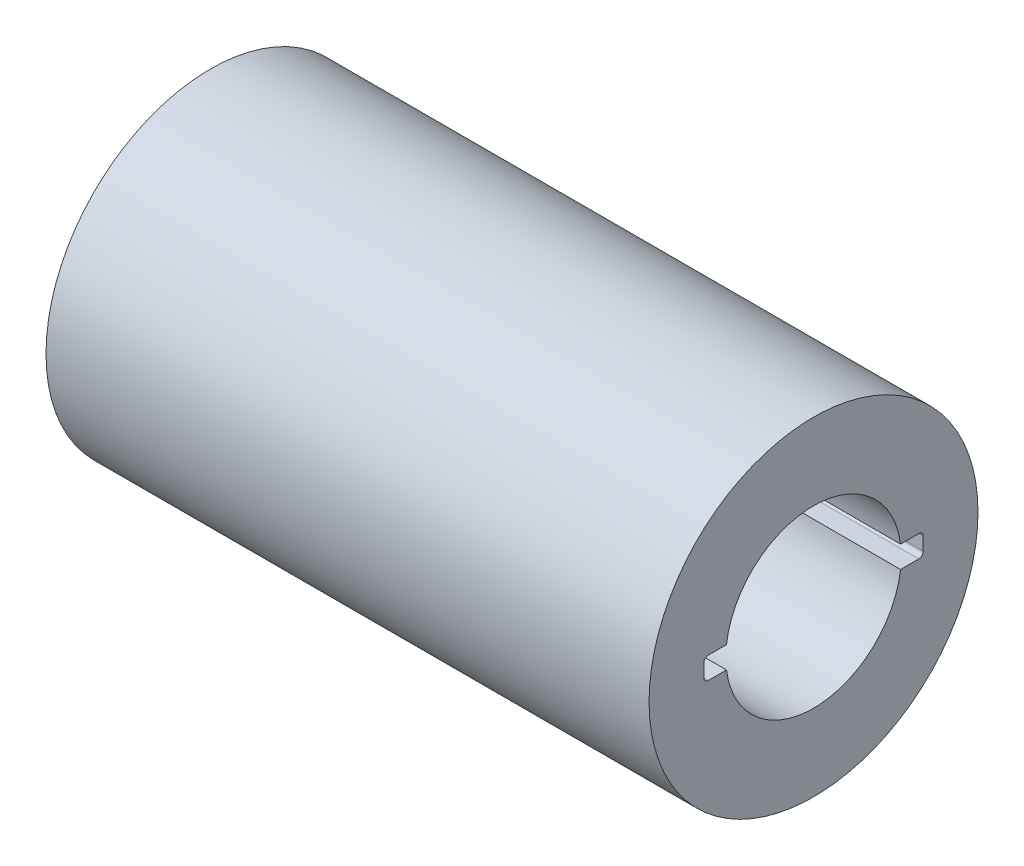
ISO-10303-21;
HEADER;
FILE_DESCRIPTION(('STEP AP214'),'2;1');
FILE_NAME('part.step','',(''),(''),'','','');
FILE_SCHEMA(('AUTOMOTIVE_DESIGN { 1 0 10303 214 1 1 1 1 }'));
ENDSEC;
DATA;
#1=APPLICATION_CONTEXT('core data for automotive mechanical design processes');
#2=APPLICATION_PROTOCOL_DEFINITION('international standard','automotive_design',2000,#1);
#3=PRODUCT_CONTEXT('',#1,'mechanical');
#4=PRODUCT('Part','Part','',(#3));
#5=PRODUCT_RELATED_PRODUCT_CATEGORY('part','',(#4));
#6=PRODUCT_DEFINITION_FORMATION('','',#4);
#7=PRODUCT_DEFINITION_CONTEXT('part definition',#1,'design');
#8=PRODUCT_DEFINITION('design','',#6,#7);
#9=PRODUCT_DEFINITION_SHAPE('','',#8);
#10=(LENGTH_UNIT() NAMED_UNIT(*) SI_UNIT(.MILLI.,.METRE.));
#11=(NAMED_UNIT(*) PLANE_ANGLE_UNIT() SI_UNIT($,.RADIAN.));
#12=(NAMED_UNIT(*) SI_UNIT($,.STERADIAN.) SOLID_ANGLE_UNIT());
#13=UNCERTAINTY_MEASURE_WITH_UNIT(LENGTH_MEASURE(1.E-05),#10,'distance_accuracy_value','');
#14=(GEOMETRIC_REPRESENTATION_CONTEXT(3) GLOBAL_UNCERTAINTY_ASSIGNED_CONTEXT((#13)) GLOBAL_UNIT_ASSIGNED_CONTEXT((#10,
#11,#12)) REPRESENTATION_CONTEXT('',''));
#15=CARTESIAN_POINT('',(0.,0.,0.));
#16=DIRECTION('',(0.,0.,1.));
#17=DIRECTION('',(1.,0.,0.));
#18=AXIS2_PLACEMENT_3D('',#15,#16,#17);
#19=CARTESIAN_POINT('',(10.,0.,0.));
#20=DIRECTION('',(-1.,0.,0.));
#21=DIRECTION('',(0.,0.,1.));
#22=AXIS2_PLACEMENT_3D('',#19,#20,#21);
#23=CYLINDRICAL_SURFACE('',#22,4.);
#24=DIRECTION('',(-1.,0.,0.));
#25=VECTOR('',#24,1.);
#26=CARTESIAN_POINT('',(10.,0.5,-3.96862696659689));
#27=LINE('',#26,#25);
#28=CARTESIAN_POINT('',(10.,0.5,-3.96862696659689));
#29=VERTEX_POINT('',#28);
#30=CARTESIAN_POINT('',(0.,0.5,-3.96862696659689));
#31=VERTEX_POINT('',#30);
#32=EDGE_CURVE('E335',#29,#31,#27,.T.);
#33=ORIENTED_EDGE('',*,*,#32,.F.);
#34=CARTESIAN_POINT('',(10.,0.,0.));
#35=DIRECTION('',(1.,0.,0.));
#36=DIRECTION('',(0.,0.,-1.));
#37=AXIS2_PLACEMENT_3D('',#34,#35,#36);
#38=CIRCLE('',#37,4.);
#39=CARTESIAN_POINT('',(10.,0.5,3.96862696659689));
#40=VERTEX_POINT('',#39);
#41=EDGE_CURVE('E251',#29,#40,#38,.T.);
#42=ORIENTED_EDGE('',*,*,#41,.T.);
#43=DIRECTION('',(-1.,0.,0.));
#44=VECTOR('',#43,1.);
#45=CARTESIAN_POINT('',(10.,0.5,3.96862696659689));
#46=LINE('',#45,#44);
#47=CARTESIAN_POINT('',(0.,0.5,3.96862696659689));
#48=VERTEX_POINT('',#47);
#49=EDGE_CURVE('E237',#48,#40,#46,.F.);
#50=ORIENTED_EDGE('',*,*,#49,.F.);
#51=CARTESIAN_POINT('',(0.,0.,0.));
#52=DIRECTION('',(1.,0.,0.));
#53=DIRECTION('',(0.,0.,-1.));
#54=AXIS2_PLACEMENT_3D('',#51,#52,#53);
#55=CIRCLE('',#54,4.);
#56=EDGE_CURVE('E242',#31,#48,#55,.T.);
#57=ORIENTED_EDGE('',*,*,#56,.F.);
#58=EDGE_LOOP('',(#33,#42,#50,#57));
#59=FACE_BOUND('',#58,.T.);
#60=ADVANCED_FACE('F41',(#59),#23,.F.);
#61=CARTESIAN_POINT('',(-17.5,0.,0.));
#62=DIRECTION('',(1.,0.,0.));
#63=DIRECTION('',(0.,0.,-1.));
#64=AXIS2_PLACEMENT_3D('',#61,#62,#63);
#65=CYLINDRICAL_SURFACE('',#64,2.5);
#66=DIRECTION('',(1.,0.,0.));
#67=VECTOR('',#66,1.);
#68=CARTESIAN_POINT('',(-17.5,-0.5,2.44948974278318));
#69=LINE('',#68,#67);
#70=CARTESIAN_POINT('',(0.,-0.5,2.44948974278318));
#71=VERTEX_POINT('',#70);
#72=CARTESIAN_POINT('',(-17.5,-0.5,2.44948974278318));
#73=VERTEX_POINT('',#72);
#74=EDGE_CURVE('E354',#71,#73,#69,.F.);
#75=ORIENTED_EDGE('',*,*,#74,.F.);
#76=CARTESIAN_POINT('',(0.,0.,0.));
#77=DIRECTION('',(-1.,0.,0.));
#78=DIRECTION('',(0.,0.,1.));
#79=AXIS2_PLACEMENT_3D('',#76,#77,#78);
#80=CIRCLE('',#79,2.5);
#81=CARTESIAN_POINT('',(0.,-2.,1.5));
#82=VERTEX_POINT('',#81);
#83=EDGE_CURVE('E764',#82,#71,#80,.T.);
#84=ORIENTED_EDGE('',*,*,#83,.F.);
#85=DIRECTION('',(1.,0.,0.));
#86=VECTOR('',#85,1.);
#87=CARTESIAN_POINT('',(-17.5,-2.,1.5));
#88=LINE('',#87,#86);
#89=CARTESIAN_POINT('',(-17.5,-2.,1.5));
#90=VERTEX_POINT('',#89);
#91=EDGE_CURVE('E243',#90,#82,#88,.T.);
#92=ORIENTED_EDGE('',*,*,#91,.F.);
#93=CARTESIAN_POINT('',(-17.5,0.,0.));
#94=DIRECTION('',(-1.,0.,0.));
#95=DIRECTION('',(0.,0.,1.));
#96=AXIS2_PLACEMENT_3D('',#93,#94,#95);
#97=CIRCLE('',#96,2.5);
#98=EDGE_CURVE('E751',#90,#73,#97,.T.);
#99=ORIENTED_EDGE('',*,*,#98,.T.);
#100=EDGE_LOOP('',(#75,#84,#92,#99));
#101=FACE_BOUND('',#100,.T.);
#102=ADVANCED_FACE('F455',(#101),#65,.F.);
#103=DIRECTION('',(1.,0.,0.));
#104=VECTOR('',#103,1.);
#105=CARTESIAN_POINT('',(-17.5,-0.5,-2.44948974278318));
#106=LINE('',#105,#104);
#107=CARTESIAN_POINT('',(-17.5,-0.5,-2.44948974278318));
#108=VERTEX_POINT('',#107);
#109=CARTESIAN_POINT('',(0.,-0.5,-2.44948974278318));
#110=VERTEX_POINT('',#109);
#111=EDGE_CURVE('E735',#108,#110,#106,.T.);
#112=ORIENTED_EDGE('',*,*,#111,.F.);
#113=CARTESIAN_POINT('',(-17.5,-2.,-1.5));
#114=VERTEX_POINT('',#113);
#115=EDGE_CURVE('E756',#108,#114,#97,.T.);
#116=ORIENTED_EDGE('',*,*,#115,.T.);
#117=DIRECTION('',(1.,0.,0.));
#118=VECTOR('',#117,1.);
#119=CARTESIAN_POINT('',(-17.5,-2.,-1.5));
#120=LINE('',#119,#118);
#121=CARTESIAN_POINT('',(0.,-2.,-1.5));
#122=VERTEX_POINT('',#121);
#123=EDGE_CURVE('E247',#114,#122,#120,.T.);
#124=ORIENTED_EDGE('',*,*,#123,.T.);
#125=EDGE_CURVE('E739',#110,#122,#80,.T.);
#126=ORIENTED_EDGE('',*,*,#125,.F.);
#127=EDGE_LOOP('',(#112,#116,#124,#126));
#128=FACE_BOUND('',#127,.T.);
#129=ADVANCED_FACE('F456',(#128),#65,.F.);
#130=CARTESIAN_POINT('',(10.,0.,0.));
#131=DIRECTION('',(1.,0.,0.));
#132=DIRECTION('',(0.,0.,-1.));
#133=AXIS2_PLACEMENT_3D('',#130,#131,#132);
#134=PLANE('',#133);
#135=DIRECTION('',(0.,0.,1.));
#136=VECTOR('',#135,1.);
#137=CARTESIAN_POINT('',(10.,0.5,5.));
#138=LINE('',#137,#136);
#139=CARTESIAN_POINT('',(10.,0.5,4.8));
#140=VERTEX_POINT('',#139);
#141=EDGE_CURVE('E385',#40,#140,#138,.T.);
#142=ORIENTED_EDGE('',*,*,#141,.F.);
#143=ORIENTED_EDGE('',*,*,#41,.F.);
#144=CARTESIAN_POINT('',(10.,0.5,-4.8));
#145=VERTEX_POINT('',#144);
#146=EDGE_CURVE('E387',#145,#29,#138,.T.);
#147=ORIENTED_EDGE('',*,*,#146,.F.);
#148=CARTESIAN_POINT('',(10.,0.3,-4.8));
#149=DIRECTION('',(1.,0.,0.));
#150=DIRECTION('',(0.,0.,-1.));
#151=AXIS2_PLACEMENT_3D('',#148,#149,#150);
#152=CIRCLE('',#151,0.2);
#153=CARTESIAN_POINT('',(10.,0.3,-5.));
#154=VERTEX_POINT('',#153);
#155=EDGE_CURVE('E307',#145,#154,#152,.F.);
#156=ORIENTED_EDGE('',*,*,#155,.T.);
#157=DIRECTION('',(0.,1.,0.));
#158=VECTOR('',#157,1.);
#159=CARTESIAN_POINT('',(10.,-0.5,-5.));
#160=LINE('',#159,#158);
#161=CARTESIAN_POINT('',(10.,-0.3,-5.));
#162=VERTEX_POINT('',#161);
#163=EDGE_CURVE('E382',#162,#154,#160,.T.);
#164=ORIENTED_EDGE('',*,*,#163,.F.);
#165=CARTESIAN_POINT('',(10.,-0.3,-4.8));
#166=DIRECTION('',(1.,0.,0.));
#167=DIRECTION('',(0.,0.,-1.));
#168=AXIS2_PLACEMENT_3D('',#165,#166,#167);
#169=CIRCLE('',#168,0.2);
#170=CARTESIAN_POINT('',(10.,-0.5,-4.8));
#171=VERTEX_POINT('',#170);
#172=EDGE_CURVE('E305',#162,#171,#169,.F.);
#173=ORIENTED_EDGE('',*,*,#172,.T.);
#174=DIRECTION('',(0.,0.,-1.));
#175=VECTOR('',#174,1.);
#176=CARTESIAN_POINT('',(10.,-0.5,5.));
#177=LINE('',#176,#175);
#178=CARTESIAN_POINT('',(10.,-0.5,-3.96862696659689));
#179=VERTEX_POINT('',#178);
#180=EDGE_CURVE('E392',#179,#171,#177,.T.);
#181=ORIENTED_EDGE('',*,*,#180,.F.);
#182=CARTESIAN_POINT('',(10.,-0.5,3.96862696659689));
#183=VERTEX_POINT('',#182);
#184=EDGE_CURVE('E246',#183,#179,#38,.T.);
#185=ORIENTED_EDGE('',*,*,#184,.F.);
#186=CARTESIAN_POINT('',(10.,-0.5,4.8));
#187=VERTEX_POINT('',#186);
#188=EDGE_CURVE('E233',#187,#183,#177,.T.);
#189=ORIENTED_EDGE('',*,*,#188,.F.);
#190=CARTESIAN_POINT('',(10.,-0.3,4.8));
#191=DIRECTION('',(1.,0.,0.));
#192=DIRECTION('',(0.,0.,-1.));
#193=AXIS2_PLACEMENT_3D('',#190,#191,#192);
#194=CIRCLE('',#193,0.2);
#195=CARTESIAN_POINT('',(10.,-0.3,5.));
#196=VERTEX_POINT('',#195);
#197=EDGE_CURVE('E309',#187,#196,#194,.F.);
#198=ORIENTED_EDGE('',*,*,#197,.T.);
#199=DIRECTION('',(0.,-1.,0.));
#200=VECTOR('',#199,1.);
#201=CARTESIAN_POINT('',(10.,-0.5,5.));
#202=LINE('',#201,#200);
#203=CARTESIAN_POINT('',(10.,0.3,5.));
#204=VERTEX_POINT('',#203);
#205=EDGE_CURVE('E389',#204,#196,#202,.T.);
#206=ORIENTED_EDGE('',*,*,#205,.F.);
#207=CARTESIAN_POINT('',(10.,0.3,4.8));
#208=DIRECTION('',(1.,0.,0.));
#209=DIRECTION('',(0.,0.,-1.));
#210=AXIS2_PLACEMENT_3D('',#207,#208,#209);
#211=CIRCLE('',#210,0.2);
#212=EDGE_CURVE('E311',#204,#140,#211,.F.);
#213=ORIENTED_EDGE('',*,*,#212,.T.);
#214=EDGE_LOOP('',(#142,#143,#147,#156,#164,#173,#181,#185,#189,#198,#206,#213));
#215=FACE_BOUND('',#214,.T.);
#216=CARTESIAN_POINT('',(10.,0.,0.));
#217=DIRECTION('',(1.,0.,0.));
#218=DIRECTION('',(0.,0.,-1.));
#219=AXIS2_PLACEMENT_3D('',#216,#217,#218);
#220=CIRCLE('',#219,7.5);
#221=CARTESIAN_POINT('',(10.,0.,-7.5));
#222=VERTEX_POINT('',#221);
#223=EDGE_CURVE('E252',#222,#222,#220,.T.);
#224=ORIENTED_EDGE('',*,*,#223,.T.);
#225=EDGE_LOOP('',(#224));
#226=FACE_BOUND('',#225,.T.);
#227=ADVANCED_FACE('F458',(#215,#226),#134,.T.);
#228=CARTESIAN_POINT('',(10.,0.,0.));
#229=DIRECTION('',(-1.,0.,0.));
#230=DIRECTION('',(0.,0.,1.));
#231=AXIS2_PLACEMENT_3D('',#228,#229,#230);
#232=CYLINDRICAL_SURFACE('',#231,7.5);
#233=CARTESIAN_POINT('',(-6.45,-7.5,0.));
#234=CARTESIAN_POINT('',(-6.44999696970773,-7.499998525365,0.0806421427634558));
#235=CARTESIAN_POINT('',(-6.44324986589986,-7.49868597665242,0.161323192666839));
#236=CARTESIAN_POINT('',(-6.41645895635309,-7.49357651302592,0.320408543714804));
#237=CARTESIAN_POINT('',(-6.39640423082013,-7.48977755788418,0.398810919860974));
#238=CARTESIAN_POINT('',(-6.34363770632334,-7.48011989701473,0.55101548040217));
#239=CARTESIAN_POINT('',(-6.31093765701646,-7.47426310382905,0.624821861561572));
#240=CARTESIAN_POINT('',(-6.23384279646442,-7.46112800440237,0.765894660004341));
#241=CARTESIAN_POINT('',(-6.18944881651136,-7.45384979921549,0.833161541699101));
#242=CARTESIAN_POINT('',(-6.08962831661002,-7.43857083725651,0.960105935767713));
#243=CARTESIAN_POINT('',(-6.03408206623181,-7.43056280433354,1.01968843405788));
#244=CARTESIAN_POINT('',(-5.91379125741996,-7.41478025299514,1.12875042127406));
#245=CARTESIAN_POINT('',(-5.84904601287441,-7.40700575205027,1.17822915593394));
#246=CARTESIAN_POINT('',(-5.71151811528634,-7.3924996521021,1.26607852812105));
#247=CARTESIAN_POINT('',(-5.63867213916168,-7.38577742580521,1.30435171779212));
#248=CARTESIAN_POINT('',(-5.4874323061246,-7.37423989227902,1.36807953082819));
#249=CARTESIAN_POINT('',(-5.40903896019504,-7.36942440968335,1.39353533308812));
#250=CARTESIAN_POINT('',(-5.24994893605672,-7.36231900353129,1.43059921980694));
#251=CARTESIAN_POINT('',(-5.1692923494942,-7.35999880074007,1.44237346906097));
#252=CARTESIAN_POINT('',(-5.0071177140268,-7.35805543655615,1.45225595276949));
#253=CARTESIAN_POINT('',(-4.92559974807015,-7.35843201779251,1.4503654913325));
#254=CARTESIAN_POINT('',(-4.76522561742081,-7.36181213102633,1.43310677489635));
#255=CARTESIAN_POINT('',(-4.68634814859589,-7.36477869652922,1.41792817142252));
#256=CARTESIAN_POINT('',(-4.53228076949582,-7.37294639178685,1.37482302272976));
#257=CARTESIAN_POINT('',(-4.45709102502739,-7.3781476219137,1.34689590489551));
#258=CARTESIAN_POINT('',(-4.311982384737,-7.39023685221375,1.27890302001373));
#259=CARTESIAN_POINT('',(-4.24209997850525,-7.39713535049046,1.2387613216085));
#260=CARTESIAN_POINT('',(-4.10999155808056,-7.4118349819013,1.1475323938677));
#261=CARTESIAN_POINT('',(-4.04776636940327,-7.4196362121823,1.0964439860049));
#262=CARTESIAN_POINT('',(-3.93164362148412,-7.43542295452934,0.983752591319254));
#263=CARTESIAN_POINT('',(-3.8779033275965,-7.44340936221107,0.921987548756471));
#264=CARTESIAN_POINT('',(-3.7815223704328,-7.45854648475334,0.790236717207604));
#265=CARTESIAN_POINT('',(-3.73888183220125,-7.46569719019877,0.72025083562237));
#266=CARTESIAN_POINT('',(-3.66588491360397,-7.47837305941719,0.573876038492479));
#267=CARTESIAN_POINT('',(-3.63554563343671,-7.48389595745544,0.497478386568492));
#268=CARTESIAN_POINT('',(-3.58817542819639,-7.49267657252717,0.340540262854948));
#269=CARTESIAN_POINT('',(-3.57114299850448,-7.49593454565336,0.260000260543014));
#270=CARTESIAN_POINT('',(-3.55109060188821,-7.49978282464045,0.0984159586628909));
#271=CARTESIAN_POINT('',(-3.54785527642259,-7.50041412629724,0.0173993302005821));
#272=CARTESIAN_POINT('',(-3.55491018919085,-7.4990514624244,-0.144017073119939));
#273=CARTESIAN_POINT('',(-3.56519971906899,-7.49705763438426,-0.224416880061964));
#274=CARTESIAN_POINT('',(-3.59883326755743,-7.49069432579966,-0.381628937454281));
#275=CARTESIAN_POINT('',(-3.62206761241448,-7.48634481210944,-0.458465530069153));
#276=CARTESIAN_POINT('',(-3.68081203605034,-7.47575591580864,-0.607152511027312));
#277=CARTESIAN_POINT('',(-3.7163229886566,-7.46951639867483,-0.679002543998769));
#278=CARTESIAN_POINT('',(-3.79908431022857,-7.45573739482256,-0.816590970736479));
#279=CARTESIAN_POINT('',(-3.84646538377945,-7.44818374153436,-0.882249295714527));
#280=CARTESIAN_POINT('',(-3.9514459619466,-7.43264938179644,-1.00476039132023));
#281=CARTESIAN_POINT('',(-4.00904648538255,-7.42466863282322,-1.06161228293827));
#282=CARTESIAN_POINT('',(-4.13380838973523,-7.4090425508686,-1.16572093482627));
#283=CARTESIAN_POINT('',(-4.20109368192709,-7.4014035731401,-1.21283031760487));
#284=CARTESIAN_POINT('',(-4.34274911537819,-7.38745689020874,-1.29507841301326));
#285=CARTESIAN_POINT('',(-4.41711898341052,-7.38114913369555,-1.33021758705248));
#286=CARTESIAN_POINT('',(-4.57046969230392,-7.37062962251973,-1.38732238328669));
#287=CARTESIAN_POINT('',(-4.6494252761417,-7.36640741549497,-1.40935381501805));
#288=CARTESIAN_POINT('',(-4.81000731569905,-7.36051395801081,-1.43981920143142));
#289=CARTESIAN_POINT('',(-4.89163344748594,-7.35884239932553,-1.44825479907043));
#290=CARTESIAN_POINT('',(-5.05376172056792,-7.35825581479954,-1.45123139559093));
#291=CARTESIAN_POINT('',(-5.13425951454366,-7.35929463226338,-1.44600504939331));
#292=CARTESIAN_POINT('',(-5.29320571889761,-7.36390904565127,-1.42231736522539));
#293=CARTESIAN_POINT('',(-5.37165414339829,-7.36748462408938,-1.4038561184835));
#294=CARTESIAN_POINT('',(-5.5241390828255,-7.37674968990959,-1.3543234478303));
#295=CARTESIAN_POINT('',(-5.59818456994134,-7.38243469459701,-1.32327875189259));
#296=CARTESIAN_POINT('',(-5.74005281280265,-7.39528093736712,-1.24948643514521));
#297=CARTESIAN_POINT('',(-5.80787509032721,-7.40244228876223,-1.20673791596219));
#298=CARTESIAN_POINT('',(-5.93653393922659,-7.41757665987797,-1.10994910376903));
#299=CARTESIAN_POINT('',(-5.99724229612996,-7.42556077438229,-1.05574008359523));
#300=CARTESIAN_POINT('',(-6.10877815222669,-7.44135962378414,-0.937919333480722));
#301=CARTESIAN_POINT('',(-6.15960337869519,-7.44917431935586,-0.874305446703062));
#302=CARTESIAN_POINT('',(-6.25039151691554,-7.46384264913767,-0.738742983791018));
#303=CARTESIAN_POINT('',(-6.29024469079006,-7.47068626414688,-0.666719791654771));
#304=CARTESIAN_POINT('',(-6.35722027409429,-7.48254317852271,-0.516888791372669));
#305=CARTESIAN_POINT('',(-6.38435442042765,-7.48755816436428,-0.439086393305169));
#306=CARTESIAN_POINT('',(-6.41972867217436,-7.49419237380928,-0.300899668743569));
#307=CARTESIAN_POINT('',(-6.431060637462,-7.4963577306211,-0.241313712590985));
#308=CARTESIAN_POINT('',(-6.44619733338625,-7.49926207753944,-0.121159140467245));
#309=CARTESIAN_POINT('',(-6.45000227681304,-7.50000110796844,-0.0605905523240655));
#310=CARTESIAN_POINT('',(-6.45,-7.5,0.));
#311=B_SPLINE_CURVE_WITH_KNOTS('',3,(#233,#234,#235,#236,#237,#238,#239,#240,#241,#242,#243,
#244,#245,#246,#247,#248,#249,#250,#251,#252,#253,#254,#255,#256,#257,#258,#259,#260,#261,#262,
#263,#264,#265,#266,#267,#268,#269,#270,#271,#272,#273,#274,#275,#276,#277,#278,#279,#280,#281,
#282,#283,#284,#285,#286,#287,#288,#289,#290,#291,#292,#293,#294,#295,#296,#297,#298,#299,#300,
#301,#302,#303,#304,#305,#306,#307,#308,#309,#310),.UNSPECIFIED.,.T.,.F.,(4,2,2,2,2,2,2,2,2,2,2,
2,2,2,2,2,2,2,2,2,2,2,2,2,2,2,2,2,2,2,2,2,2,2,2,2,2,2,4),(0.,0.241704810649837,
0.483608201937102,0.725287361809705,0.966949345953302,1.21135973972972,1.45578837256521,
1.70228348184305,1.94875591528754,2.19220253374382,2.43562591887867,2.67563072842972,
2.91564631915497,3.15718554095799,3.39875078005028,3.64436964818046,3.88999128321554,
4.13595320018157,4.3818873019619,4.62396824505461,4.86603650981643,5.10608439476873,
5.34614936942841,5.58898383147776,5.83184251632733,6.07814249251753,6.32443297363543,
6.56947624394217,6.81448990034292,7.05535840625101,7.29622525186418,7.53658314120012,
7.77695948533422,8.02115769748762,8.26541199922855,8.5120271406285,8.75841425955026,
8.94002453811927,9.12162968246192),.UNSPECIFIED.);
#312=CARTESIAN_POINT('',(-6.45,-7.5,0.));
#313=VERTEX_POINT('',#312);
#314=EDGE_CURVE('E386',#313,#313,#311,.T.);
#315=ORIENTED_EDGE('',*,*,#314,.T.);
#316=EDGE_LOOP('',(#315));
#317=FACE_BOUND('',#316,.T.);
#318=ORIENTED_EDGE('',*,*,#223,.F.);
#319=EDGE_LOOP('',(#318));
#320=FACE_BOUND('',#319,.T.);
#321=CARTESIAN_POINT('',(-17.5,0.,0.));
#322=DIRECTION('',(-1.,0.,0.));
#323=DIRECTION('',(0.,0.,1.));
#324=AXIS2_PLACEMENT_3D('',#321,#322,#323);
#325=CIRCLE('',#324,7.5);
#326=CARTESIAN_POINT('',(-17.5,0.,7.5));
#327=VERTEX_POINT('',#326);
#328=EDGE_CURVE('E757',#327,#327,#325,.T.);
#329=ORIENTED_EDGE('',*,*,#328,.F.);
#330=EDGE_LOOP('',(#329));
#331=FACE_BOUND('',#330,.T.);
#332=ADVANCED_FACE('F402',(#317,#320,#331),#232,.T.);
#333=DIRECTION('',(-1.,0.,0.));
#334=VECTOR('',#333,1.);
#335=CARTESIAN_POINT('',(10.,-0.5,3.96862696659689));
#336=LINE('',#335,#334);
#337=CARTESIAN_POINT('',(0.,-0.5,3.96862696659689));
#338=VERTEX_POINT('',#337);
#339=EDGE_CURVE('E230',#183,#338,#336,.T.);
#340=ORIENTED_EDGE('',*,*,#339,.F.);
#341=ORIENTED_EDGE('',*,*,#184,.T.);
#342=DIRECTION('',(-1.,0.,0.));
#343=VECTOR('',#342,1.);
#344=CARTESIAN_POINT('',(10.,-0.5,-3.96862696659689));
#345=LINE('',#344,#343);
#346=CARTESIAN_POINT('',(0.,-0.5,-3.96862696659689));
#347=VERTEX_POINT('',#346);
#348=EDGE_CURVE('E238',#347,#179,#345,.F.);
#349=ORIENTED_EDGE('',*,*,#348,.F.);
#350=EDGE_CURVE('E219',#338,#347,#55,.T.);
#351=ORIENTED_EDGE('',*,*,#350,.F.);
#352=EDGE_LOOP('',(#340,#341,#349,#351));
#353=FACE_BOUND('',#352,.T.);
#354=ADVANCED_FACE('F241',(#353),#23,.F.);
#355=CARTESIAN_POINT('',(0.,0.,0.));
#356=DIRECTION('',(-1.,0.,0.));
#357=DIRECTION('',(0.,0.,1.));
#358=AXIS2_PLACEMENT_3D('',#355,#356,#357);
#359=PLANE('',#358);
#360=DIRECTION('',(0.,0.,1.));
#361=VECTOR('',#360,1.);
#362=CARTESIAN_POINT('',(0.,-0.5,0.));
#363=LINE('',#362,#361);
#364=CARTESIAN_POINT('',(0.,-0.5,3.3));
#365=VERTEX_POINT('',#364);
#366=EDGE_CURVE('E738',#71,#365,#363,.T.);
#367=ORIENTED_EDGE('',*,*,#366,.T.);
#368=CARTESIAN_POINT('',(0.,-0.3,3.3));
#369=DIRECTION('',(-1.,0.,0.));
#370=DIRECTION('',(0.,0.,1.));
#371=AXIS2_PLACEMENT_3D('',#368,#369,#370);
#372=CIRCLE('',#371,0.2);
#373=CARTESIAN_POINT('',(0.,-0.3,3.5));
#374=VERTEX_POINT('',#373);
#375=EDGE_CURVE('E322',#365,#374,#372,.T.);
#376=ORIENTED_EDGE('',*,*,#375,.T.);
#377=DIRECTION('',(0.,1.,0.));
#378=VECTOR('',#377,1.);
#379=CARTESIAN_POINT('',(0.,0.,3.5));
#380=LINE('',#379,#378);
#381=CARTESIAN_POINT('',(0.,0.3,3.5));
#382=VERTEX_POINT('',#381);
#383=EDGE_CURVE('E344',#374,#382,#380,.T.);
#384=ORIENTED_EDGE('',*,*,#383,.T.);
#385=CARTESIAN_POINT('',(0.,0.3,3.3));
#386=DIRECTION('',(-1.,0.,0.));
#387=DIRECTION('',(0.,0.,1.));
#388=AXIS2_PLACEMENT_3D('',#385,#386,#387);
#389=CIRCLE('',#388,0.2);
#390=CARTESIAN_POINT('',(0.,0.5,3.3));
#391=VERTEX_POINT('',#390);
#392=EDGE_CURVE('E11',#382,#391,#389,.T.);
#393=ORIENTED_EDGE('',*,*,#392,.T.);
#394=DIRECTION('',(0.,0.,-1.));
#395=VECTOR('',#394,1.);
#396=CARTESIAN_POINT('',(0.,0.5,0.));
#397=LINE('',#396,#395);
#398=CARTESIAN_POINT('',(0.,0.5,2.44948974278318));
#399=VERTEX_POINT('',#398);
#400=EDGE_CURVE('E342',#391,#399,#397,.T.);
#401=ORIENTED_EDGE('',*,*,#400,.T.);
#402=CARTESIAN_POINT('',(0.,0.5,-2.44948974278318));
#403=VERTEX_POINT('',#402);
#404=EDGE_CURVE('E767',#399,#403,#80,.T.);
#405=ORIENTED_EDGE('',*,*,#404,.T.);
#406=CARTESIAN_POINT('',(0.,0.5,-3.3));
#407=VERTEX_POINT('',#406);
#408=EDGE_CURVE('E352',#403,#407,#397,.T.);
#409=ORIENTED_EDGE('',*,*,#408,.T.);
#410=CARTESIAN_POINT('',(0.,0.3,-3.3));
#411=DIRECTION('',(-1.,0.,0.));
#412=DIRECTION('',(0.,0.,1.));
#413=AXIS2_PLACEMENT_3D('',#410,#411,#412);
#414=CIRCLE('',#413,0.2);
#415=CARTESIAN_POINT('',(0.,0.3,-3.5));
#416=VERTEX_POINT('',#415);
#417=EDGE_CURVE('E319',#407,#416,#414,.T.);
#418=ORIENTED_EDGE('',*,*,#417,.T.);
#419=DIRECTION('',(0.,-1.,0.));
#420=VECTOR('',#419,1.);
#421=CARTESIAN_POINT('',(0.,0.,-3.5));
#422=LINE('',#421,#420);
#423=CARTESIAN_POINT('',(0.,-0.3,-3.5));
#424=VERTEX_POINT('',#423);
#425=EDGE_CURVE('E350',#416,#424,#422,.T.);
#426=ORIENTED_EDGE('',*,*,#425,.T.);
#427=CARTESIAN_POINT('',(0.,-0.3,-3.3));
#428=DIRECTION('',(-1.,0.,0.));
#429=DIRECTION('',(0.,0.,1.));
#430=AXIS2_PLACEMENT_3D('',#427,#428,#429);
#431=CIRCLE('',#430,0.2);
#432=CARTESIAN_POINT('',(0.,-0.5,-3.3));
#433=VERTEX_POINT('',#432);
#434=EDGE_CURVE('E315',#424,#433,#431,.T.);
#435=ORIENTED_EDGE('',*,*,#434,.T.);
#436=EDGE_CURVE('E731',#433,#110,#363,.T.);
#437=ORIENTED_EDGE('',*,*,#436,.T.);
#438=ORIENTED_EDGE('',*,*,#125,.T.);
#439=DIRECTION('',(0.,0.,1.));
#440=VECTOR('',#439,1.);
#441=CARTESIAN_POINT('',(0.,-2.,0.));
#442=LINE('',#441,#440);
#443=EDGE_CURVE('E759',#122,#82,#442,.T.);
#444=ORIENTED_EDGE('',*,*,#443,.T.);
#445=ORIENTED_EDGE('',*,*,#83,.T.);
#446=EDGE_LOOP('',(#367,#376,#384,#393,#401,#405,#409,#418,#426,#435,#437,#438,#444,#445));
#447=FACE_BOUND('',#446,.T.);
#448=DIRECTION('',(0.,0.,-1.));
#449=VECTOR('',#448,1.);
#450=CARTESIAN_POINT('',(0.,-0.5,5.));
#451=LINE('',#450,#449);
#452=CARTESIAN_POINT('',(0.,-0.5,-4.8));
#453=VERTEX_POINT('',#452);
#454=EDGE_CURVE('E227',#347,#453,#451,.T.);
#455=ORIENTED_EDGE('',*,*,#454,.T.);
#456=CARTESIAN_POINT('',(0.,-0.3,-4.8));
#457=DIRECTION('',(-1.,0.,0.));
#458=DIRECTION('',(0.,0.,1.));
#459=AXIS2_PLACEMENT_3D('',#456,#457,#458);
#460=CIRCLE('',#459,0.2);
#461=CARTESIAN_POINT('',(0.,-0.3,-5.));
#462=VERTEX_POINT('',#461);
#463=EDGE_CURVE('E272',#453,#462,#460,.F.);
#464=ORIENTED_EDGE('',*,*,#463,.T.);
#465=DIRECTION('',(0.,1.,0.));
#466=VECTOR('',#465,1.);
#467=CARTESIAN_POINT('',(0.,-0.5,-5.));
#468=LINE('',#467,#466);
#469=CARTESIAN_POINT('',(0.,0.3,-5.));
#470=VERTEX_POINT('',#469);
#471=EDGE_CURVE('E226',#462,#470,#468,.T.);
#472=ORIENTED_EDGE('',*,*,#471,.T.);
#473=CARTESIAN_POINT('',(0.,0.3,-4.8));
#474=DIRECTION('',(-1.,0.,0.));
#475=DIRECTION('',(0.,0.,1.));
#476=AXIS2_PLACEMENT_3D('',#473,#474,#475);
#477=CIRCLE('',#476,0.2);
#478=CARTESIAN_POINT('',(0.,0.5,-4.8));
#479=VERTEX_POINT('',#478);
#480=EDGE_CURVE('E270',#470,#479,#477,.F.);
#481=ORIENTED_EDGE('',*,*,#480,.T.);
#482=DIRECTION('',(0.,0.,1.));
#483=VECTOR('',#482,1.);
#484=CARTESIAN_POINT('',(0.,0.5,5.));
#485=LINE('',#484,#483);
#486=EDGE_CURVE('E376',#479,#31,#485,.T.);
#487=ORIENTED_EDGE('',*,*,#486,.T.);
#488=ORIENTED_EDGE('',*,*,#56,.T.);
#489=CARTESIAN_POINT('',(0.,0.5,4.8));
#490=VERTEX_POINT('',#489);
#491=EDGE_CURVE('E381',#48,#490,#485,.T.);
#492=ORIENTED_EDGE('',*,*,#491,.T.);
#493=CARTESIAN_POINT('',(0.,0.3,4.8));
#494=DIRECTION('',(-1.,0.,0.));
#495=DIRECTION('',(0.,0.,1.));
#496=AXIS2_PLACEMENT_3D('',#493,#494,#495);
#497=CIRCLE('',#496,0.2);
#498=CARTESIAN_POINT('',(0.,0.3,5.));
#499=VERTEX_POINT('',#498);
#500=EDGE_CURVE('E267',#490,#499,#497,.F.);
#501=ORIENTED_EDGE('',*,*,#500,.T.);
#502=DIRECTION('',(0.,-1.,0.));
#503=VECTOR('',#502,1.);
#504=CARTESIAN_POINT('',(0.,-0.5,5.));
#505=LINE('',#504,#503);
#506=CARTESIAN_POINT('',(0.,-0.3,5.));
#507=VERTEX_POINT('',#506);
#508=EDGE_CURVE('E375',#499,#507,#505,.T.);
#509=ORIENTED_EDGE('',*,*,#508,.T.);
#510=CARTESIAN_POINT('',(0.,-0.3,4.8));
#511=DIRECTION('',(-1.,0.,0.));
#512=DIRECTION('',(0.,0.,1.));
#513=AXIS2_PLACEMENT_3D('',#510,#511,#512);
#514=CIRCLE('',#513,0.2);
#515=CARTESIAN_POINT('',(0.,-0.5,4.8));
#516=VERTEX_POINT('',#515);
#517=EDGE_CURVE('E222',#507,#516,#514,.F.);
#518=ORIENTED_EDGE('',*,*,#517,.T.);
#519=EDGE_CURVE('E214',#516,#338,#451,.T.);
#520=ORIENTED_EDGE('',*,*,#519,.T.);
#521=ORIENTED_EDGE('',*,*,#350,.T.);
#522=EDGE_LOOP('',(#455,#464,#472,#481,#487,#488,#492,#501,#509,#518,#520,#521));
#523=FACE_BOUND('',#522,.T.);
#524=ADVANCED_FACE('F217',(#447,#523),#359,.F.);
#525=DIRECTION('',(1.,0.,0.));
#526=VECTOR('',#525,1.);
#527=CARTESIAN_POINT('',(-17.5,0.5,2.44948974278318));
#528=LINE('',#527,#526);
#529=CARTESIAN_POINT('',(-17.5,0.5,2.44948974278318));
#530=VERTEX_POINT('',#529);
#531=EDGE_CURVE('E348',#530,#399,#528,.T.);
#532=ORIENTED_EDGE('',*,*,#531,.F.);
#533=CARTESIAN_POINT('',(-17.5,0.5,-2.44948974278318));
#534=VERTEX_POINT('',#533);
#535=EDGE_CURVE('E754',#530,#534,#97,.T.);
#536=ORIENTED_EDGE('',*,*,#535,.T.);
#537=DIRECTION('',(1.,0.,0.));
#538=VECTOR('',#537,1.);
#539=CARTESIAN_POINT('',(-17.5,0.5,-2.44948974278318));
#540=LINE('',#539,#538);
#541=EDGE_CURVE('E359',#403,#534,#540,.F.);
#542=ORIENTED_EDGE('',*,*,#541,.F.);
#543=ORIENTED_EDGE('',*,*,#404,.F.);
#544=EDGE_LOOP('',(#532,#536,#542,#543));
#545=FACE_BOUND('',#544,.T.);
#546=ADVANCED_FACE('F448',(#545),#65,.F.);
#547=CARTESIAN_POINT('',(-17.5,-2.,0.));
#548=DIRECTION('',(0.,1.,0.));
#549=DIRECTION('',(0.,0.,1.));
#550=AXIS2_PLACEMENT_3D('',#547,#548,#549);
#551=PLANE('',#550);
#552=CARTESIAN_POINT('',(-5.,-2.,0.));
#553=DIRECTION('',(0.,1.,0.));
#554=DIRECTION('',(0.,0.,1.));
#555=AXIS2_PLACEMENT_3D('',#552,#553,#554);
#556=CIRCLE('',#555,1.45);
#557=CARTESIAN_POINT('',(-5.,-2.,1.45));
#558=VERTEX_POINT('',#557);
#559=EDGE_CURVE('E401',#558,#558,#556,.T.);
#560=ORIENTED_EDGE('',*,*,#559,.F.);
#561=EDGE_LOOP('',(#560));
#562=FACE_BOUND('',#561,.T.);
#563=ORIENTED_EDGE('',*,*,#443,.F.);
#564=ORIENTED_EDGE('',*,*,#123,.F.);
#565=DIRECTION('',(0.,0.,1.));
#566=VECTOR('',#565,1.);
#567=CARTESIAN_POINT('',(-17.5,-2.,0.));
#568=LINE('',#567,#566);
#569=EDGE_CURVE('E753',#114,#90,#568,.T.);
#570=ORIENTED_EDGE('',*,*,#569,.T.);
#571=ORIENTED_EDGE('',*,*,#91,.T.);
#572=EDGE_LOOP('',(#563,#564,#570,#571));
#573=FACE_BOUND('',#572,.T.);
#574=ADVANCED_FACE('F445',(#562,#573),#551,.T.);
#575=CARTESIAN_POINT('',(-17.5,0.,0.));
#576=DIRECTION('',(-1.,0.,0.));
#577=DIRECTION('',(0.,0.,1.));
#578=AXIS2_PLACEMENT_3D('',#575,#576,#577);
#579=PLANE('',#578);
#580=DIRECTION('',(0.,0.,1.));
#581=VECTOR('',#580,1.);
#582=CARTESIAN_POINT('',(-17.5,-0.5,0.));
#583=LINE('',#582,#581);
#584=CARTESIAN_POINT('',(-17.5,-0.5,3.3));
#585=VERTEX_POINT('',#584);
#586=EDGE_CURVE('E258',#73,#585,#583,.T.);
#587=ORIENTED_EDGE('',*,*,#586,.F.);
#588=ORIENTED_EDGE('',*,*,#98,.F.);
#589=ORIENTED_EDGE('',*,*,#569,.F.);
#590=ORIENTED_EDGE('',*,*,#115,.F.);
#591=DIRECTION('',(0.,0.,1.));
#592=VECTOR('',#591,1.);
#593=CARTESIAN_POINT('',(-17.5,-0.5,-3.5));
#594=LINE('',#593,#592);
#595=CARTESIAN_POINT('',(-17.5,-0.5,-3.3));
#596=VERTEX_POINT('',#595);
#597=EDGE_CURVE('E361',#596,#108,#594,.T.);
#598=ORIENTED_EDGE('',*,*,#597,.F.);
#599=CARTESIAN_POINT('',(-17.5,-0.3,-3.3));
#600=DIRECTION('',(-1.,0.,0.));
#601=DIRECTION('',(0.,0.,1.));
#602=AXIS2_PLACEMENT_3D('',#599,#600,#601);
#603=CIRCLE('',#602,0.2);
#604=CARTESIAN_POINT('',(-17.5,-0.3,-3.5));
#605=VERTEX_POINT('',#604);
#606=EDGE_CURVE('E313',#596,#605,#603,.F.);
#607=ORIENTED_EDGE('',*,*,#606,.T.);
#608=DIRECTION('',(0.,-1.,0.));
#609=VECTOR('',#608,1.);
#610=CARTESIAN_POINT('',(-17.5,-0.5,-3.5));
#611=LINE('',#610,#609);
#612=CARTESIAN_POINT('',(-17.5,0.3,-3.5));
#613=VERTEX_POINT('',#612);
#614=EDGE_CURVE('E365',#613,#605,#611,.T.);
#615=ORIENTED_EDGE('',*,*,#614,.F.);
#616=CARTESIAN_POINT('',(-17.5,0.3,-3.3));
#617=DIRECTION('',(-1.,0.,0.));
#618=DIRECTION('',(0.,0.,1.));
#619=AXIS2_PLACEMENT_3D('',#616,#617,#618);
#620=CIRCLE('',#619,0.2);
#621=CARTESIAN_POINT('',(-17.5,0.5,-3.3));
#622=VERTEX_POINT('',#621);
#623=EDGE_CURVE('E317',#613,#622,#620,.F.);
#624=ORIENTED_EDGE('',*,*,#623,.T.);
#625=DIRECTION('',(0.,0.,-1.));
#626=VECTOR('',#625,1.);
#627=CARTESIAN_POINT('',(-17.5,0.5,0.));
#628=LINE('',#627,#626);
#629=EDGE_CURVE('E255',#534,#622,#628,.T.);
#630=ORIENTED_EDGE('',*,*,#629,.F.);
#631=ORIENTED_EDGE('',*,*,#535,.F.);
#632=DIRECTION('',(0.,0.,-1.));
#633=VECTOR('',#632,1.);
#634=CARTESIAN_POINT('',(-17.5,0.5,-3.5));
#635=LINE('',#634,#633);
#636=CARTESIAN_POINT('',(-17.5,0.5,3.3));
#637=VERTEX_POINT('',#636);
#638=EDGE_CURVE('E329',#637,#530,#635,.T.);
#639=ORIENTED_EDGE('',*,*,#638,.F.);
#640=CARTESIAN_POINT('',(-17.5,0.3,3.3));
#641=DIRECTION('',(-1.,0.,0.));
#642=DIRECTION('',(0.,0.,1.));
#643=AXIS2_PLACEMENT_3D('',#640,#641,#642);
#644=CIRCLE('',#643,0.2);
#645=CARTESIAN_POINT('',(-17.5,0.3,3.5));
#646=VERTEX_POINT('',#645);
#647=EDGE_CURVE('E49',#637,#646,#644,.F.);
#648=ORIENTED_EDGE('',*,*,#647,.T.);
#649=DIRECTION('',(0.,1.,0.));
#650=VECTOR('',#649,1.);
#651=CARTESIAN_POINT('',(-17.5,-0.5,3.5));
#652=LINE('',#651,#650);
#653=CARTESIAN_POINT('',(-17.5,-0.3,3.5));
#654=VERTEX_POINT('',#653);
#655=EDGE_CURVE('E327',#654,#646,#652,.T.);
#656=ORIENTED_EDGE('',*,*,#655,.F.);
#657=CARTESIAN_POINT('',(-17.5,-0.3,3.3));
#658=DIRECTION('',(-1.,0.,0.));
#659=DIRECTION('',(0.,0.,1.));
#660=AXIS2_PLACEMENT_3D('',#657,#658,#659);
#661=CIRCLE('',#660,0.2);
#662=EDGE_CURVE('E63',#654,#585,#661,.F.);
#663=ORIENTED_EDGE('',*,*,#662,.T.);
#664=EDGE_LOOP('',(#587,#588,#589,#590,#598,#607,#615,#624,#630,#631,#639,#648,#656,#663));
#665=FACE_BOUND('',#664,.T.);
#666=ORIENTED_EDGE('',*,*,#328,.T.);
#667=EDGE_LOOP('',(#666));
#668=FACE_BOUND('',#667,.T.);
#669=ADVANCED_FACE('F325',(#665,#668),#579,.T.);
#670=CARTESIAN_POINT('',(10.,0.5,-3.5));
#671=DIRECTION('',(0.,1.,0.));
#672=DIRECTION('',(0.,0.,1.));
#673=AXIS2_PLACEMENT_3D('',#670,#671,#672);
#674=PLANE('',#673);
#675=ORIENTED_EDGE('',*,*,#629,.T.);
#676=DIRECTION('',(-1.,0.,0.));
#677=VECTOR('',#676,1.);
#678=CARTESIAN_POINT('',(0.,0.5,-3.3));
#679=LINE('',#678,#677);
#680=EDGE_CURVE('E294',#622,#407,#679,.F.);
#681=ORIENTED_EDGE('',*,*,#680,.T.);
#682=ORIENTED_EDGE('',*,*,#408,.F.);
#683=ORIENTED_EDGE('',*,*,#541,.T.);
#684=EDGE_LOOP('',(#675,#681,#682,#683));
#685=FACE_BOUND('',#684,.T.);
#686=ADVANCED_FACE('F437',(#685),#674,.F.);
#687=CARTESIAN_POINT('',(10.,-0.5,-3.5));
#688=DIRECTION('',(0.,0.,-1.));
#689=DIRECTION('',(-1.,0.,0.));
#690=AXIS2_PLACEMENT_3D('',#687,#688,#689);
#691=PLANE('',#690);
#692=ORIENTED_EDGE('',*,*,#614,.T.);
#693=DIRECTION('',(-1.,0.,0.));
#694=VECTOR('',#693,1.);
#695=CARTESIAN_POINT('',(0.,-0.3,-3.5));
#696=LINE('',#695,#694);
#697=EDGE_CURVE('E292',#605,#424,#696,.F.);
#698=ORIENTED_EDGE('',*,*,#697,.T.);
#699=ORIENTED_EDGE('',*,*,#425,.F.);
#700=DIRECTION('',(-1.,0.,0.));
#701=VECTOR('',#700,1.);
#702=CARTESIAN_POINT('',(-17.5,0.3,-3.5));
#703=LINE('',#702,#701);
#704=EDGE_CURVE('E289',#416,#613,#703,.T.);
#705=ORIENTED_EDGE('',*,*,#704,.T.);
#706=EDGE_LOOP('',(#692,#698,#699,#705));
#707=FACE_BOUND('',#706,.T.);
#708=ADVANCED_FACE('F432',(#707),#691,.F.);
#709=CARTESIAN_POINT('',(10.,-0.5,-3.5));
#710=DIRECTION('',(0.,-1.,0.));
#711=DIRECTION('',(0.,0.,-1.));
#712=AXIS2_PLACEMENT_3D('',#709,#710,#711);
#713=PLANE('',#712);
#714=ORIENTED_EDGE('',*,*,#436,.F.);
#715=DIRECTION('',(-1.,0.,0.));
#716=VECTOR('',#715,1.);
#717=CARTESIAN_POINT('',(-17.5,-0.5,-3.3));
#718=LINE('',#717,#716);
#719=EDGE_CURVE('E286',#433,#596,#718,.T.);
#720=ORIENTED_EDGE('',*,*,#719,.T.);
#721=ORIENTED_EDGE('',*,*,#597,.T.);
#722=ORIENTED_EDGE('',*,*,#111,.T.);
#723=EDGE_LOOP('',(#714,#720,#721,#722));
#724=FACE_BOUND('',#723,.T.);
#725=ADVANCED_FACE('F429',(#724),#713,.F.);
#726=CARTESIAN_POINT('',(10.,-0.5,3.5));
#727=DIRECTION('',(0.,0.,1.));
#728=DIRECTION('',(1.,0.,0.));
#729=AXIS2_PLACEMENT_3D('',#726,#727,#728);
#730=PLANE('',#729);
#731=ORIENTED_EDGE('',*,*,#383,.F.);
#732=DIRECTION('',(-1.,0.,0.));
#733=VECTOR('',#732,1.);
#734=CARTESIAN_POINT('',(-17.5,-0.3,3.5));
#735=LINE('',#734,#733);
#736=EDGE_CURVE('E298',#374,#654,#735,.T.);
#737=ORIENTED_EDGE('',*,*,#736,.T.);
#738=ORIENTED_EDGE('',*,*,#655,.T.);
#739=DIRECTION('',(-1.,0.,0.));
#740=VECTOR('',#739,1.);
#741=CARTESIAN_POINT('',(0.,0.3,3.5));
#742=LINE('',#741,#740);
#743=EDGE_CURVE('E296',#646,#382,#742,.F.);
#744=ORIENTED_EDGE('',*,*,#743,.T.);
#745=EDGE_LOOP('',(#731,#737,#738,#744));
#746=FACE_BOUND('',#745,.T.);
#747=ADVANCED_FACE('F332',(#746),#730,.F.);
#748=ORIENTED_EDGE('',*,*,#586,.T.);
#749=DIRECTION('',(-1.,0.,0.));
#750=VECTOR('',#749,1.);
#751=CARTESIAN_POINT('',(0.,-0.5,3.3));
#752=LINE('',#751,#750);
#753=EDGE_CURVE('E301',#585,#365,#752,.F.);
#754=ORIENTED_EDGE('',*,*,#753,.T.);
#755=ORIENTED_EDGE('',*,*,#366,.F.);
#756=ORIENTED_EDGE('',*,*,#74,.T.);
#757=EDGE_LOOP('',(#748,#754,#755,#756));
#758=FACE_BOUND('',#757,.T.);
#759=ADVANCED_FACE('F434',(#758),#713,.F.);
#760=ORIENTED_EDGE('',*,*,#400,.F.);
#761=DIRECTION('',(-1.,0.,0.));
#762=VECTOR('',#761,1.);
#763=CARTESIAN_POINT('',(-17.5,0.5,3.3));
#764=LINE('',#763,#762);
#765=EDGE_CURVE('E303',#391,#637,#764,.T.);
#766=ORIENTED_EDGE('',*,*,#765,.T.);
#767=ORIENTED_EDGE('',*,*,#638,.T.);
#768=ORIENTED_EDGE('',*,*,#531,.T.);
#769=EDGE_LOOP('',(#760,#766,#767,#768));
#770=FACE_BOUND('',#769,.T.);
#771=ADVANCED_FACE('F346',(#770),#674,.F.);
#772=CARTESIAN_POINT('',(-10.0498756211209,-0.5,5.));
#773=DIRECTION('',(0.,-1.,0.));
#774=DIRECTION('',(0.,0.,-1.));
#775=AXIS2_PLACEMENT_3D('',#772,#773,#774);
#776=PLANE('',#775);
#777=ORIENTED_EDGE('',*,*,#180,.T.);
#778=DIRECTION('',(1.,0.,0.));
#779=VECTOR('',#778,1.);
#780=CARTESIAN_POINT('',(0.,-0.5,-4.8));
#781=LINE('',#780,#779);
#782=EDGE_CURVE('E265',#171,#453,#781,.F.);
#783=ORIENTED_EDGE('',*,*,#782,.T.);
#784=ORIENTED_EDGE('',*,*,#454,.F.);
#785=ORIENTED_EDGE('',*,*,#348,.T.);
#786=EDGE_LOOP('',(#777,#783,#784,#785));
#787=FACE_BOUND('',#786,.T.);
#788=ADVANCED_FACE('F416',(#787),#776,.F.);
#789=CARTESIAN_POINT('',(-10.0498756211209,0.5,5.));
#790=DIRECTION('',(0.,1.,0.));
#791=DIRECTION('',(0.,0.,1.));
#792=AXIS2_PLACEMENT_3D('',#789,#790,#791);
#793=PLANE('',#792);
#794=ORIENTED_EDGE('',*,*,#486,.F.);
#795=DIRECTION('',(1.,0.,0.));
#796=VECTOR('',#795,1.);
#797=CARTESIAN_POINT('',(10.,0.5,-4.8));
#798=LINE('',#797,#796);
#799=EDGE_CURVE('E274',#479,#145,#798,.T.);
#800=ORIENTED_EDGE('',*,*,#799,.T.);
#801=ORIENTED_EDGE('',*,*,#146,.T.);
#802=ORIENTED_EDGE('',*,*,#32,.T.);
#803=EDGE_LOOP('',(#794,#800,#801,#802));
#804=FACE_BOUND('',#803,.T.);
#805=ADVANCED_FACE('F414',(#804),#793,.F.);
#806=CARTESIAN_POINT('',(-10.0498756211209,-0.5,-5.));
#807=DIRECTION('',(0.,0.,-1.));
#808=DIRECTION('',(-1.,0.,0.));
#809=AXIS2_PLACEMENT_3D('',#806,#807,#808);
#810=PLANE('',#809);
#811=ORIENTED_EDGE('',*,*,#471,.F.);
#812=DIRECTION('',(1.,0.,0.));
#813=VECTOR('',#812,1.);
#814=CARTESIAN_POINT('',(10.,-0.3,-5.));
#815=LINE('',#814,#813);
#816=EDGE_CURVE('E262',#462,#162,#815,.T.);
#817=ORIENTED_EDGE('',*,*,#816,.T.);
#818=ORIENTED_EDGE('',*,*,#163,.T.);
#819=DIRECTION('',(1.,0.,0.));
#820=VECTOR('',#819,1.);
#821=CARTESIAN_POINT('',(0.,0.3,-5.));
#822=LINE('',#821,#820);
#823=EDGE_CURVE('E260',#154,#470,#822,.F.);
#824=ORIENTED_EDGE('',*,*,#823,.T.);
#825=EDGE_LOOP('',(#811,#817,#818,#824));
#826=FACE_BOUND('',#825,.T.);
#827=ADVANCED_FACE('F411',(#826),#810,.F.);
#828=ORIENTED_EDGE('',*,*,#519,.F.);
#829=DIRECTION('',(1.,0.,0.));
#830=VECTOR('',#829,1.);
#831=CARTESIAN_POINT('',(10.,-0.5,4.8));
#832=LINE('',#831,#830);
#833=EDGE_CURVE('E277',#516,#187,#832,.T.);
#834=ORIENTED_EDGE('',*,*,#833,.T.);
#835=ORIENTED_EDGE('',*,*,#188,.T.);
#836=ORIENTED_EDGE('',*,*,#339,.T.);
#837=EDGE_LOOP('',(#828,#834,#835,#836));
#838=FACE_BOUND('',#837,.T.);
#839=ADVANCED_FACE('F231',(#838),#776,.F.);
#840=ORIENTED_EDGE('',*,*,#141,.T.);
#841=DIRECTION('',(1.,0.,0.));
#842=VECTOR('',#841,1.);
#843=CARTESIAN_POINT('',(0.,0.5,4.8));
#844=LINE('',#843,#842);
#845=EDGE_CURVE('E284',#140,#490,#844,.F.);
#846=ORIENTED_EDGE('',*,*,#845,.T.);
#847=ORIENTED_EDGE('',*,*,#491,.F.);
#848=ORIENTED_EDGE('',*,*,#49,.T.);
#849=EDGE_LOOP('',(#840,#846,#847,#848));
#850=FACE_BOUND('',#849,.T.);
#851=ADVANCED_FACE('F424',(#850),#793,.F.);
#852=CARTESIAN_POINT('',(-10.0498756211209,-0.5,5.));
#853=DIRECTION('',(0.,0.,1.));
#854=DIRECTION('',(1.,0.,0.));
#855=AXIS2_PLACEMENT_3D('',#852,#853,#854);
#856=PLANE('',#855);
#857=ORIENTED_EDGE('',*,*,#205,.T.);
#858=DIRECTION('',(1.,0.,0.));
#859=VECTOR('',#858,1.);
#860=CARTESIAN_POINT('',(0.,-0.3,5.));
#861=LINE('',#860,#859);
#862=EDGE_CURVE('E282',#196,#507,#861,.F.);
#863=ORIENTED_EDGE('',*,*,#862,.T.);
#864=ORIENTED_EDGE('',*,*,#508,.F.);
#865=DIRECTION('',(1.,0.,0.));
#866=VECTOR('',#865,1.);
#867=CARTESIAN_POINT('',(10.,0.3,5.));
#868=LINE('',#867,#866);
#869=EDGE_CURVE('E279',#499,#204,#868,.T.);
#870=ORIENTED_EDGE('',*,*,#869,.T.);
#871=EDGE_LOOP('',(#857,#863,#864,#870));
#872=FACE_BOUND('',#871,.T.);
#873=ADVANCED_FACE('F420',(#872),#856,.F.);
#874=CARTESIAN_POINT('',(-10.0498756211209,-0.3,-4.8));
#875=DIRECTION('',(-1.,0.,0.));
#876=DIRECTION('',(0.,0.,1.));
#877=AXIS2_PLACEMENT_3D('',#874,#875,#876);
#878=CYLINDRICAL_SURFACE('',#877,0.2);
#879=ORIENTED_EDGE('',*,*,#463,.F.);
#880=ORIENTED_EDGE('',*,*,#782,.F.);
#881=ORIENTED_EDGE('',*,*,#172,.F.);
#882=ORIENTED_EDGE('',*,*,#816,.F.);
#883=EDGE_LOOP('',(#879,#880,#881,#882));
#884=FACE_BOUND('',#883,.T.);
#885=ADVANCED_FACE('F423',(#884),#878,.F.);
#886=CARTESIAN_POINT('',(-10.0498756211209,0.3,-4.8));
#887=DIRECTION('',(-1.,0.,0.));
#888=DIRECTION('',(0.,0.,1.));
#889=AXIS2_PLACEMENT_3D('',#886,#887,#888);
#890=CYLINDRICAL_SURFACE('',#889,0.2);
#891=ORIENTED_EDGE('',*,*,#480,.F.);
#892=ORIENTED_EDGE('',*,*,#823,.F.);
#893=ORIENTED_EDGE('',*,*,#155,.F.);
#894=ORIENTED_EDGE('',*,*,#799,.F.);
#895=EDGE_LOOP('',(#891,#892,#893,#894));
#896=FACE_BOUND('',#895,.T.);
#897=ADVANCED_FACE('F495',(#896),#890,.F.);
#898=CARTESIAN_POINT('',(-10.0498756211209,-0.3,4.8));
#899=DIRECTION('',(-1.,0.,0.));
#900=DIRECTION('',(0.,0.,1.));
#901=AXIS2_PLACEMENT_3D('',#898,#899,#900);
#902=CYLINDRICAL_SURFACE('',#901,0.2);
#903=ORIENTED_EDGE('',*,*,#517,.F.);
#904=ORIENTED_EDGE('',*,*,#862,.F.);
#905=ORIENTED_EDGE('',*,*,#197,.F.);
#906=ORIENTED_EDGE('',*,*,#833,.F.);
#907=EDGE_LOOP('',(#903,#904,#905,#906));
#908=FACE_BOUND('',#907,.T.);
#909=ADVANCED_FACE('F536',(#908),#902,.F.);
#910=CARTESIAN_POINT('',(-10.0498756211209,0.3,4.8));
#911=DIRECTION('',(-1.,0.,0.));
#912=DIRECTION('',(0.,0.,1.));
#913=AXIS2_PLACEMENT_3D('',#910,#911,#912);
#914=CYLINDRICAL_SURFACE('',#913,0.2);
#915=ORIENTED_EDGE('',*,*,#500,.F.);
#916=ORIENTED_EDGE('',*,*,#845,.F.);
#917=ORIENTED_EDGE('',*,*,#212,.F.);
#918=ORIENTED_EDGE('',*,*,#869,.F.);
#919=EDGE_LOOP('',(#915,#916,#917,#918));
#920=FACE_BOUND('',#919,.T.);
#921=ADVANCED_FACE('F544',(#920),#914,.F.);
#922=CARTESIAN_POINT('',(10.,-0.3,-3.3));
#923=DIRECTION('',(1.,0.,0.));
#924=DIRECTION('',(0.,0.,-1.));
#925=AXIS2_PLACEMENT_3D('',#922,#923,#924);
#926=CYLINDRICAL_SURFACE('',#925,0.2);
#927=ORIENTED_EDGE('',*,*,#434,.F.);
#928=ORIENTED_EDGE('',*,*,#697,.F.);
#929=ORIENTED_EDGE('',*,*,#606,.F.);
#930=ORIENTED_EDGE('',*,*,#719,.F.);
#931=EDGE_LOOP('',(#927,#928,#929,#930));
#932=FACE_BOUND('',#931,.T.);
#933=ADVANCED_FACE('F553',(#932),#926,.F.);
#934=CARTESIAN_POINT('',(10.,0.3,-3.3));
#935=DIRECTION('',(1.,0.,0.));
#936=DIRECTION('',(0.,0.,-1.));
#937=AXIS2_PLACEMENT_3D('',#934,#935,#936);
#938=CYLINDRICAL_SURFACE('',#937,0.2);
#939=ORIENTED_EDGE('',*,*,#417,.F.);
#940=ORIENTED_EDGE('',*,*,#680,.F.);
#941=ORIENTED_EDGE('',*,*,#623,.F.);
#942=ORIENTED_EDGE('',*,*,#704,.F.);
#943=EDGE_LOOP('',(#939,#940,#941,#942));
#944=FACE_BOUND('',#943,.T.);
#945=ADVANCED_FACE('F562',(#944),#938,.F.);
#946=CARTESIAN_POINT('',(10.,-0.3,3.3));
#947=DIRECTION('',(1.,0.,0.));
#948=DIRECTION('',(0.,0.,-1.));
#949=AXIS2_PLACEMENT_3D('',#946,#947,#948);
#950=CYLINDRICAL_SURFACE('',#949,0.2);
#951=ORIENTED_EDGE('',*,*,#375,.F.);
#952=ORIENTED_EDGE('',*,*,#753,.F.);
#953=ORIENTED_EDGE('',*,*,#662,.F.);
#954=ORIENTED_EDGE('',*,*,#736,.F.);
#955=EDGE_LOOP('',(#951,#952,#953,#954));
#956=FACE_BOUND('',#955,.T.);
#957=ADVANCED_FACE('F571',(#956),#950,.F.);
#958=CARTESIAN_POINT('',(10.,0.3,3.3));
#959=DIRECTION('',(1.,0.,0.));
#960=DIRECTION('',(0.,0.,-1.));
#961=AXIS2_PLACEMENT_3D('',#958,#959,#960);
#962=CYLINDRICAL_SURFACE('',#961,0.2);
#963=ORIENTED_EDGE('',*,*,#392,.F.);
#964=ORIENTED_EDGE('',*,*,#743,.F.);
#965=ORIENTED_EDGE('',*,*,#647,.F.);
#966=ORIENTED_EDGE('',*,*,#765,.F.);
#967=EDGE_LOOP('',(#963,#964,#965,#966));
#968=FACE_BOUND('',#967,.T.);
#969=ADVANCED_FACE('F43',(#968),#962,.F.);
#970=CARTESIAN_POINT('',(-5.,-7.5,0.));
#971=DIRECTION('',(0.,1.,0.));
#972=DIRECTION('',(0.,0.,1.));
#973=AXIS2_PLACEMENT_3D('',#970,#971,#972);
#974=CYLINDRICAL_SURFACE('',#973,1.45);
#975=ORIENTED_EDGE('',*,*,#559,.T.);
#976=EDGE_LOOP('',(#975));
#977=FACE_BOUND('',#976,.T.);
#978=ORIENTED_EDGE('',*,*,#314,.F.);
#979=EDGE_LOOP('',(#978));
#980=FACE_BOUND('',#979,.T.);
#981=ADVANCED_FACE('F406',(#977,#980),#974,.F.);
#982=CLOSED_SHELL('',(#60,#102,#129,#227,#332,#354,#524,#546,#574,#669,#686,#708,#725,#747,#759,
#771,#788,#805,#827,#839,#851,#873,#885,#897,#909,#921,#933,#945,#957,#969,#981));
#983=MANIFOLD_SOLID_BREP('B2',#982);
#984=ADVANCED_BREP_SHAPE_REPRESENTATION('',(#18,#983),#14);
#985=SHAPE_DEFINITION_REPRESENTATION(#9,#984);
ENDSEC;
END-ISO-10303-21;
